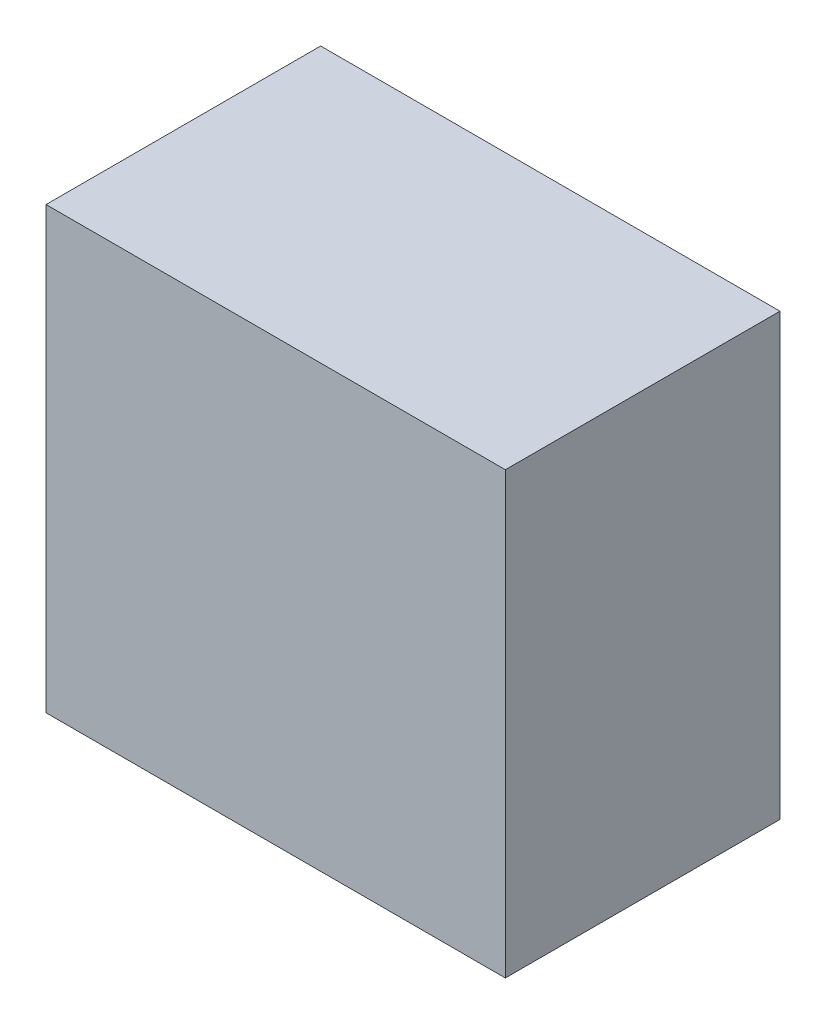
ISO-10303-21;
HEADER;
FILE_DESCRIPTION(('STEP AP214'),'2;1');
FILE_NAME('part.step','',(''),(''),'','','');
FILE_SCHEMA(('AUTOMOTIVE_DESIGN { 1 0 10303 214 1 1 1 1 }'));
ENDSEC;
DATA;
#1=APPLICATION_CONTEXT('core data for automotive mechanical design processes');
#2=APPLICATION_PROTOCOL_DEFINITION('international standard','automotive_design',2000,#1);
#3=PRODUCT_CONTEXT('',#1,'mechanical');
#4=PRODUCT('Part','Part','',(#3));
#5=PRODUCT_RELATED_PRODUCT_CATEGORY('part','',(#4));
#6=PRODUCT_DEFINITION_FORMATION('','',#4);
#7=PRODUCT_DEFINITION_CONTEXT('part definition',#1,'design');
#8=PRODUCT_DEFINITION('design','',#6,#7);
#9=PRODUCT_DEFINITION_SHAPE('','',#8);
#10=(LENGTH_UNIT() NAMED_UNIT(*) SI_UNIT(.MILLI.,.METRE.));
#11=(NAMED_UNIT(*) PLANE_ANGLE_UNIT() SI_UNIT($,.RADIAN.));
#12=(NAMED_UNIT(*) SI_UNIT($,.STERADIAN.) SOLID_ANGLE_UNIT());
#13=UNCERTAINTY_MEASURE_WITH_UNIT(LENGTH_MEASURE(1.E-05),#10,'distance_accuracy_value','');
#14=(GEOMETRIC_REPRESENTATION_CONTEXT(3) GLOBAL_UNCERTAINTY_ASSIGNED_CONTEXT((#13)) GLOBAL_UNIT_ASSIGNED_CONTEXT((#10,
#11,#12)) REPRESENTATION_CONTEXT('',''));
#15=CARTESIAN_POINT('',(0.,0.,0.));
#16=DIRECTION('',(0.,0.,1.));
#17=DIRECTION('',(1.,0.,0.));
#18=AXIS2_PLACEMENT_3D('',#15,#16,#17);
#19=CARTESIAN_POINT('',(-7.527,-10.317,9.));
#20=DIRECTION('',(1.,0.,0.));
#21=DIRECTION('',(0.,0.,-1.));
#22=AXIS2_PLACEMENT_3D('',#19,#20,#21);
#23=PLANE('',#22);
#24=DIRECTION('',(0.,-1.,0.));
#25=VECTOR('',#24,1.);
#26=CARTESIAN_POINT('',(-7.527,-10.317,0.));
#27=LINE('',#26,#25);
#28=CARTESIAN_POINT('',(-7.527,4.11,0.));
#29=VERTEX_POINT('',#28);
#30=CARTESIAN_POINT('',(-7.527,-10.317,0.));
#31=VERTEX_POINT('',#30);
#32=EDGE_CURVE('E95',#29,#31,#27,.T.);
#33=ORIENTED_EDGE('',*,*,#32,.T.);
#34=DIRECTION('',(0.,0.,-1.));
#35=VECTOR('',#34,1.);
#36=CARTESIAN_POINT('',(-7.527,-10.317,9.));
#37=LINE('',#36,#35);
#38=CARTESIAN_POINT('',(-7.527,-10.317,9.));
#39=VERTEX_POINT('',#38);
#40=EDGE_CURVE('E11',#39,#31,#37,.T.);
#41=ORIENTED_EDGE('',*,*,#40,.F.);
#42=DIRECTION('',(0.,-1.,0.));
#43=VECTOR('',#42,1.);
#44=CARTESIAN_POINT('',(-7.527,-10.317,9.));
#45=LINE('',#44,#43);
#46=CARTESIAN_POINT('',(-7.527,4.11,9.));
#47=VERTEX_POINT('',#46);
#48=EDGE_CURVE('E83',#47,#39,#45,.T.);
#49=ORIENTED_EDGE('',*,*,#48,.F.);
#50=DIRECTION('',(0.,0.,-1.));
#51=VECTOR('',#50,1.);
#52=CARTESIAN_POINT('',(-7.527,4.11,9.));
#53=LINE('',#52,#51);
#54=EDGE_CURVE('E91',#47,#29,#53,.T.);
#55=ORIENTED_EDGE('',*,*,#54,.T.);
#56=EDGE_LOOP('',(#33,#41,#49,#55));
#57=FACE_BOUND('',#56,.T.);
#58=ADVANCED_FACE('F32',(#57),#23,.F.);
#59=CARTESIAN_POINT('',(7.527,-10.317,9.));
#60=DIRECTION('',(0.,1.,0.));
#61=DIRECTION('',(0.,0.,1.));
#62=AXIS2_PLACEMENT_3D('',#59,#60,#61);
#63=PLANE('',#62);
#64=DIRECTION('',(1.,0.,0.));
#65=VECTOR('',#64,1.);
#66=CARTESIAN_POINT('',(7.527,-10.317,0.));
#67=LINE('',#66,#65);
#68=CARTESIAN_POINT('',(7.527,-10.317,0.));
#69=VERTEX_POINT('',#68);
#70=EDGE_CURVE('E87',#31,#69,#67,.T.);
#71=ORIENTED_EDGE('',*,*,#70,.T.);
#72=DIRECTION('',(0.,0.,-1.));
#73=VECTOR('',#72,1.);
#74=CARTESIAN_POINT('',(7.527,-10.317,9.));
#75=LINE('',#74,#73);
#76=CARTESIAN_POINT('',(7.527,-10.317,9.));
#77=VERTEX_POINT('',#76);
#78=EDGE_CURVE('E40',#77,#69,#75,.T.);
#79=ORIENTED_EDGE('',*,*,#78,.F.);
#80=DIRECTION('',(1.,0.,0.));
#81=VECTOR('',#80,1.);
#82=CARTESIAN_POINT('',(7.527,-10.317,9.));
#83=LINE('',#82,#81);
#84=EDGE_CURVE('E78',#39,#77,#83,.T.);
#85=ORIENTED_EDGE('',*,*,#84,.F.);
#86=ORIENTED_EDGE('',*,*,#40,.T.);
#87=EDGE_LOOP('',(#71,#79,#85,#86));
#88=FACE_BOUND('',#87,.T.);
#89=ADVANCED_FACE('F86',(#88),#63,.F.);
#90=CARTESIAN_POINT('',(7.527,4.11,9.));
#91=DIRECTION('',(-1.,0.,0.));
#92=DIRECTION('',(0.,0.,1.));
#93=AXIS2_PLACEMENT_3D('',#90,#91,#92);
#94=PLANE('',#93);
#95=DIRECTION('',(0.,1.,0.));
#96=VECTOR('',#95,1.);
#97=CARTESIAN_POINT('',(7.527,4.11,0.));
#98=LINE('',#97,#96);
#99=CARTESIAN_POINT('',(7.527,4.11,0.));
#100=VERTEX_POINT('',#99);
#101=EDGE_CURVE('E65',#69,#100,#98,.T.);
#102=ORIENTED_EDGE('',*,*,#101,.T.);
#103=DIRECTION('',(0.,0.,-1.));
#104=VECTOR('',#103,1.);
#105=CARTESIAN_POINT('',(7.527,4.11,9.));
#106=LINE('',#105,#104);
#107=CARTESIAN_POINT('',(7.527,4.11,9.));
#108=VERTEX_POINT('',#107);
#109=EDGE_CURVE('E88',#108,#100,#106,.T.);
#110=ORIENTED_EDGE('',*,*,#109,.F.);
#111=DIRECTION('',(0.,1.,0.));
#112=VECTOR('',#111,1.);
#113=CARTESIAN_POINT('',(7.527,4.11,9.));
#114=LINE('',#113,#112);
#115=EDGE_CURVE('E81',#77,#108,#114,.T.);
#116=ORIENTED_EDGE('',*,*,#115,.F.);
#117=ORIENTED_EDGE('',*,*,#78,.T.);
#118=EDGE_LOOP('',(#102,#110,#116,#117));
#119=FACE_BOUND('',#118,.T.);
#120=ADVANCED_FACE('F89',(#119),#94,.F.);
#121=CARTESIAN_POINT('',(-7.527,4.11,9.));
#122=DIRECTION('',(0.,-1.,0.));
#123=DIRECTION('',(0.,0.,-1.));
#124=AXIS2_PLACEMENT_3D('',#121,#122,#123);
#125=PLANE('',#124);
#126=DIRECTION('',(-1.,0.,0.));
#127=VECTOR('',#126,1.);
#128=CARTESIAN_POINT('',(-7.527,4.11,0.));
#129=LINE('',#128,#127);
#130=EDGE_CURVE('E71',#100,#29,#129,.T.);
#131=ORIENTED_EDGE('',*,*,#130,.T.);
#132=ORIENTED_EDGE('',*,*,#54,.F.);
#133=DIRECTION('',(-1.,0.,0.));
#134=VECTOR('',#133,1.);
#135=CARTESIAN_POINT('',(-7.527,4.11,9.));
#136=LINE('',#135,#134);
#137=EDGE_CURVE('E48',#108,#47,#136,.T.);
#138=ORIENTED_EDGE('',*,*,#137,.F.);
#139=ORIENTED_EDGE('',*,*,#109,.T.);
#140=EDGE_LOOP('',(#131,#132,#138,#139));
#141=FACE_BOUND('',#140,.T.);
#142=ADVANCED_FACE('F102',(#141),#125,.F.);
#143=CARTESIAN_POINT('',(0.,0.,9.));
#144=DIRECTION('',(0.,0.,-1.));
#145=DIRECTION('',(-1.,0.,0.));
#146=AXIS2_PLACEMENT_3D('',#143,#144,#145);
#147=PLANE('',#146);
#148=ORIENTED_EDGE('',*,*,#48,.T.);
#149=ORIENTED_EDGE('',*,*,#84,.T.);
#150=ORIENTED_EDGE('',*,*,#115,.T.);
#151=ORIENTED_EDGE('',*,*,#137,.T.);
#152=EDGE_LOOP('',(#148,#149,#150,#151));
#153=FACE_BOUND('',#152,.T.);
#154=ADVANCED_FACE('F79',(#153),#147,.F.);
#155=CARTESIAN_POINT('',(0.,0.,0.));
#156=DIRECTION('',(0.,0.,-1.));
#157=DIRECTION('',(-1.,0.,0.));
#158=AXIS2_PLACEMENT_3D('',#155,#156,#157);
#159=PLANE('',#158);
#160=ORIENTED_EDGE('',*,*,#32,.F.);
#161=ORIENTED_EDGE('',*,*,#130,.F.);
#162=ORIENTED_EDGE('',*,*,#101,.F.);
#163=ORIENTED_EDGE('',*,*,#70,.F.);
#164=EDGE_LOOP('',(#160,#161,#162,#163));
#165=FACE_BOUND('',#164,.T.);
#166=ADVANCED_FACE('F105',(#165),#159,.T.);
#167=CLOSED_SHELL('',(#58,#89,#120,#142,#154,#166));
#168=MANIFOLD_SOLID_BREP('B2',#167);
#169=ADVANCED_BREP_SHAPE_REPRESENTATION('',(#18,#168),#14);
#170=SHAPE_DEFINITION_REPRESENTATION(#9,#169);
ENDSEC;
END-ISO-10303-21;
